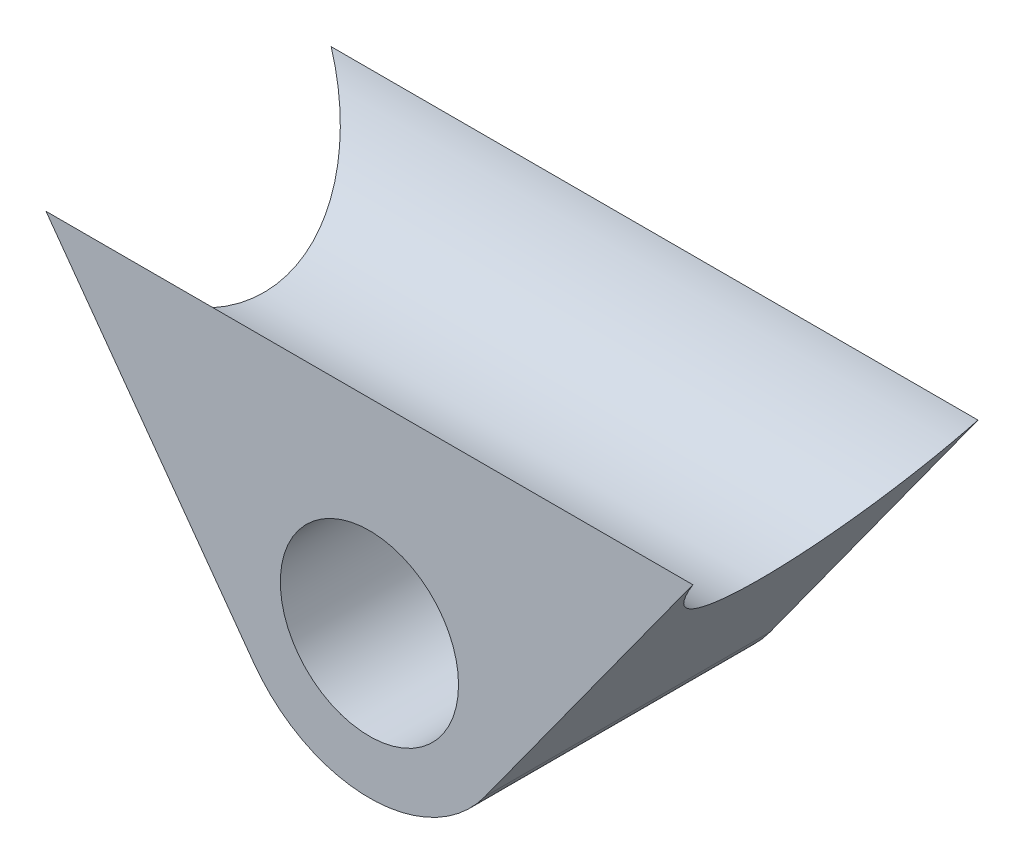
ISO-10303-21;
HEADER;
FILE_DESCRIPTION(('STEP AP214'),'2;1');
FILE_NAME('part.step','',(''),(''),'','','');
FILE_SCHEMA(('AUTOMOTIVE_DESIGN { 1 0 10303 214 1 1 1 1 }'));
ENDSEC;
DATA;
#1=APPLICATION_CONTEXT('core data for automotive mechanical design processes');
#2=APPLICATION_PROTOCOL_DEFINITION('international standard','automotive_design',2000,#1);
#3=PRODUCT_CONTEXT('',#1,'mechanical');
#4=PRODUCT('Part','Part','',(#3));
#5=PRODUCT_RELATED_PRODUCT_CATEGORY('part','',(#4));
#6=PRODUCT_DEFINITION_FORMATION('','',#4);
#7=PRODUCT_DEFINITION_CONTEXT('part definition',#1,'design');
#8=PRODUCT_DEFINITION('design','',#6,#7);
#9=PRODUCT_DEFINITION_SHAPE('','',#8);
#10=(LENGTH_UNIT() NAMED_UNIT(*) SI_UNIT(.MILLI.,.METRE.));
#11=(NAMED_UNIT(*) PLANE_ANGLE_UNIT() SI_UNIT($,.RADIAN.));
#12=(NAMED_UNIT(*) SI_UNIT($,.STERADIAN.) SOLID_ANGLE_UNIT());
#13=UNCERTAINTY_MEASURE_WITH_UNIT(LENGTH_MEASURE(1.E-05),#10,'distance_accuracy_value','');
#14=(GEOMETRIC_REPRESENTATION_CONTEXT(3) GLOBAL_UNCERTAINTY_ASSIGNED_CONTEXT((#13)) GLOBAL_UNIT_ASSIGNED_CONTEXT((#10,
#11,#12)) REPRESENTATION_CONTEXT('',''));
#15=CARTESIAN_POINT('',(0.,0.,0.));
#16=DIRECTION('',(0.,0.,1.));
#17=DIRECTION('',(1.,0.,0.));
#18=AXIS2_PLACEMENT_3D('',#15,#16,#17);
#19=CARTESIAN_POINT('',(0.,0.,0.));
#20=DIRECTION('',(0.,0.,1.));
#21=DIRECTION('',(1.,0.,0.));
#22=AXIS2_PLACEMENT_3D('',#19,#20,#21);
#23=CYLINDRICAL_SURFACE('',#22,12.7);
#24=CARTESIAN_POINT('',(0.,0.,25.4));
#25=DIRECTION('',(0.,0.,1.));
#26=DIRECTION('',(1.,0.,0.));
#27=AXIS2_PLACEMENT_3D('',#24,#25,#26);
#28=CIRCLE('',#27,12.7);
#29=CARTESIAN_POINT('',(-10.2902336554781,-7.44319093639726,25.4));
#30=VERTEX_POINT('',#29);
#31=CARTESIAN_POINT('',(10.2902336554781,-7.44319093639726,25.4));
#32=VERTEX_POINT('',#31);
#33=EDGE_CURVE('E74',#30,#32,#28,.T.);
#34=ORIENTED_EDGE('',*,*,#33,.F.);
#35=DIRECTION('',(0.,0.,1.));
#36=VECTOR('',#35,1.);
#37=CARTESIAN_POINT('',(-10.2902336554781,-7.44319093639726,0.));
#38=LINE('',#37,#36);
#39=CARTESIAN_POINT('',(-10.2902336554781,-7.44319093639726,0.));
#40=VERTEX_POINT('',#39);
#41=EDGE_CURVE('E41',#40,#30,#38,.T.);
#42=ORIENTED_EDGE('',*,*,#41,.F.);
#43=CARTESIAN_POINT('',(0.,0.,0.));
#44=DIRECTION('',(0.,0.,1.));
#45=DIRECTION('',(1.,0.,0.));
#46=AXIS2_PLACEMENT_3D('',#43,#44,#45);
#47=CIRCLE('',#46,12.7);
#48=CARTESIAN_POINT('',(10.2902336554781,-7.44319093639726,0.));
#49=VERTEX_POINT('',#48);
#50=EDGE_CURVE('E75',#40,#49,#47,.T.);
#51=ORIENTED_EDGE('',*,*,#50,.T.);
#52=DIRECTION('',(0.,0.,1.));
#53=VECTOR('',#52,1.);
#54=CARTESIAN_POINT('',(10.2902336554781,-7.44319093639726,0.));
#55=LINE('',#54,#53);
#56=EDGE_CURVE('E82',#49,#32,#55,.T.);
#57=ORIENTED_EDGE('',*,*,#56,.T.);
#58=EDGE_LOOP('',(#34,#42,#51,#57));
#59=FACE_BOUND('',#58,.T.);
#60=ADVANCED_FACE('F34',(#59),#23,.T.);
#61=CARTESIAN_POINT('',(-10.2902336554781,-7.44319093639726,0.));
#62=DIRECTION('',(-0.810254618541581,-0.586078026487973,0.));
#63=DIRECTION('',(0.586078026487973,-0.810254618541581,0.));
#64=AXIS2_PLACEMENT_3D('',#61,#62,#63);
#65=PLANE('',#64);
#66=CARTESIAN_POINT('',(-31.75,22.225,12.7));
#67=DIRECTION('',(-0.810254618541581,-0.586078026487973,0.));
#68=DIRECTION('',(0.586078026487973,-0.810254618541581,0.));
#69=AXIS2_PLACEMENT_3D('',#66,#67,#68);
#70=ELLIPSE('',#69,16.457789557562,13.335);
#71=CARTESIAN_POINT('',(-28.8089691685762,18.1590161092301,0.));
#72=VERTEX_POINT('',#71);
#73=CARTESIAN_POINT('',(-28.8089691685762,18.1590161092301,25.4));
#74=VERTEX_POINT('',#73);
#75=EDGE_CURVE('E47',#72,#74,#70,.T.);
#76=ORIENTED_EDGE('',*,*,#75,.F.);
#77=DIRECTION('',(0.586078026487973,-0.810254618541581,0.));
#78=VECTOR('',#77,1.);
#79=CARTESIAN_POINT('',(-10.2902336554781,-7.44319093639726,0.));
#80=LINE('',#79,#78);
#81=EDGE_CURVE('E55',#72,#40,#80,.T.);
#82=ORIENTED_EDGE('',*,*,#81,.T.);
#83=ORIENTED_EDGE('',*,*,#41,.T.);
#84=DIRECTION('',(0.586078026487973,-0.810254618541581,0.));
#85=VECTOR('',#84,1.);
#86=CARTESIAN_POINT('',(-10.2902336554781,-7.44319093639726,25.4));
#87=LINE('',#86,#85);
#88=EDGE_CURVE('E69',#74,#30,#87,.T.);
#89=ORIENTED_EDGE('',*,*,#88,.F.);
#90=EDGE_LOOP('',(#76,#82,#83,#89));
#91=FACE_BOUND('',#90,.T.);
#92=ADVANCED_FACE('F78',(#91),#65,.T.);
#93=CARTESIAN_POINT('',(31.75,22.225,0.));
#94=DIRECTION('',(0.810254618541581,-0.586078026487973,0.));
#95=DIRECTION('',(0.586078026487973,0.810254618541581,0.));
#96=AXIS2_PLACEMENT_3D('',#93,#94,#95);
#97=PLANE('',#96);
#98=CARTESIAN_POINT('',(31.75,22.225,12.7));
#99=DIRECTION('',(0.810254618541581,-0.586078026487973,0.));
#100=DIRECTION('',(0.586078026487973,0.810254618541581,0.));
#101=AXIS2_PLACEMENT_3D('',#98,#99,#100);
#102=ELLIPSE('',#101,16.457789557562,13.335);
#103=CARTESIAN_POINT('',(28.8089691685762,18.1590161092301,25.4));
#104=VERTEX_POINT('',#103);
#105=CARTESIAN_POINT('',(28.8089691685762,18.1590161092301,0.));
#106=VERTEX_POINT('',#105);
#107=EDGE_CURVE('E107',#104,#106,#102,.T.);
#108=ORIENTED_EDGE('',*,*,#107,.F.);
#109=DIRECTION('',(0.586078026487973,0.810254618541581,0.));
#110=VECTOR('',#109,1.);
#111=CARTESIAN_POINT('',(31.75,22.225,25.4));
#112=LINE('',#111,#110);
#113=EDGE_CURVE('E76',#32,#104,#112,.T.);
#114=ORIENTED_EDGE('',*,*,#113,.F.);
#115=ORIENTED_EDGE('',*,*,#56,.F.);
#116=DIRECTION('',(0.586078026487973,0.810254618541581,0.));
#117=VECTOR('',#116,1.);
#118=CARTESIAN_POINT('',(31.75,22.225,0.));
#119=LINE('',#118,#117);
#120=EDGE_CURVE('E93',#49,#106,#119,.T.);
#121=ORIENTED_EDGE('',*,*,#120,.T.);
#122=EDGE_LOOP('',(#108,#114,#115,#121));
#123=FACE_BOUND('',#122,.T.);
#124=ADVANCED_FACE('F116',(#123),#97,.T.);
#125=CARTESIAN_POINT('',(0.,0.,0.));
#126=DIRECTION('',(0.,0.,1.));
#127=DIRECTION('',(1.,0.,0.));
#128=AXIS2_PLACEMENT_3D('',#125,#126,#127);
#129=PLANE('',#128);
#130=CARTESIAN_POINT('',(0.,0.,0.));
#131=DIRECTION('',(0.,0.,1.));
#132=DIRECTION('',(1.,0.,0.));
#133=AXIS2_PLACEMENT_3D('',#130,#131,#132);
#134=CIRCLE('',#133,7.9375);
#135=CARTESIAN_POINT('',(7.9375,0.,0.));
#136=VERTEX_POINT('',#135);
#137=EDGE_CURVE('E85',#136,#136,#134,.T.);
#138=ORIENTED_EDGE('',*,*,#137,.T.);
#139=EDGE_LOOP('',(#138));
#140=FACE_BOUND('',#139,.T.);
#141=ORIENTED_EDGE('',*,*,#81,.F.);
#142=DIRECTION('',(1.,0.,0.));
#143=VECTOR('',#142,1.);
#144=CARTESIAN_POINT('',(-73.025,18.1590161092301,0.));
#145=LINE('',#144,#143);
#146=EDGE_CURVE('E102',#72,#106,#145,.T.);
#147=ORIENTED_EDGE('',*,*,#146,.T.);
#148=ORIENTED_EDGE('',*,*,#120,.F.);
#149=ORIENTED_EDGE('',*,*,#50,.F.);
#150=EDGE_LOOP('',(#141,#147,#148,#149));
#151=FACE_BOUND('',#150,.T.);
#152=ADVANCED_FACE('F113',(#140,#151),#129,.F.);
#153=CARTESIAN_POINT('',(0.,0.,25.4));
#154=DIRECTION('',(0.,0.,1.));
#155=DIRECTION('',(1.,0.,0.));
#156=AXIS2_PLACEMENT_3D('',#153,#154,#155);
#157=PLANE('',#156);
#158=DIRECTION('',(1.,0.,0.));
#159=VECTOR('',#158,1.);
#160=CARTESIAN_POINT('',(-73.025,18.1590161092301,25.4));
#161=LINE('',#160,#159);
#162=EDGE_CURVE('E11',#74,#104,#161,.T.);
#163=ORIENTED_EDGE('',*,*,#162,.F.);
#164=ORIENTED_EDGE('',*,*,#88,.T.);
#165=ORIENTED_EDGE('',*,*,#33,.T.);
#166=ORIENTED_EDGE('',*,*,#113,.T.);
#167=EDGE_LOOP('',(#163,#164,#165,#166));
#168=FACE_BOUND('',#167,.T.);
#169=CARTESIAN_POINT('',(0.,0.,25.4));
#170=DIRECTION('',(0.,0.,1.));
#171=DIRECTION('',(1.,0.,0.));
#172=AXIS2_PLACEMENT_3D('',#169,#170,#171);
#173=CIRCLE('',#172,7.9375);
#174=CARTESIAN_POINT('',(7.9375,0.,25.4));
#175=VERTEX_POINT('',#174);
#176=EDGE_CURVE('E89',#175,#175,#173,.T.);
#177=ORIENTED_EDGE('',*,*,#176,.F.);
#178=EDGE_LOOP('',(#177));
#179=FACE_BOUND('',#178,.T.);
#180=ADVANCED_FACE('F70',(#168,#179),#157,.T.);
#181=CARTESIAN_POINT('',(0.,0.,0.));
#182=DIRECTION('',(0.,0.,1.));
#183=DIRECTION('',(1.,0.,0.));
#184=AXIS2_PLACEMENT_3D('',#181,#182,#183);
#185=CYLINDRICAL_SURFACE('',#184,7.9375);
#186=ORIENTED_EDGE('',*,*,#137,.F.);
#187=EDGE_LOOP('',(#186));
#188=FACE_BOUND('',#187,.T.);
#189=ORIENTED_EDGE('',*,*,#176,.T.);
#190=EDGE_LOOP('',(#189));
#191=FACE_BOUND('',#190,.T.);
#192=ADVANCED_FACE('F123',(#188,#191),#185,.F.);
#193=CARTESIAN_POINT('',(-73.025,22.225,12.7));
#194=DIRECTION('',(1.,0.,0.));
#195=DIRECTION('',(0.,0.,-1.));
#196=AXIS2_PLACEMENT_3D('',#193,#194,#195);
#197=CYLINDRICAL_SURFACE('',#196,13.335);
#198=ORIENTED_EDGE('',*,*,#75,.T.);
#199=ORIENTED_EDGE('',*,*,#162,.T.);
#200=ORIENTED_EDGE('',*,*,#107,.T.);
#201=ORIENTED_EDGE('',*,*,#146,.F.);
#202=EDGE_LOOP('',(#198,#199,#200,#201));
#203=FACE_BOUND('',#202,.T.);
#204=ADVANCED_FACE('F109',(#203),#197,.F.);
#205=CLOSED_SHELL('',(#60,#92,#124,#152,#180,#192,#204));
#206=MANIFOLD_SOLID_BREP('B2',#205);
#207=ADVANCED_BREP_SHAPE_REPRESENTATION('',(#18,#206),#14);
#208=SHAPE_DEFINITION_REPRESENTATION(#9,#207);
ENDSEC;
END-ISO-10303-21;
